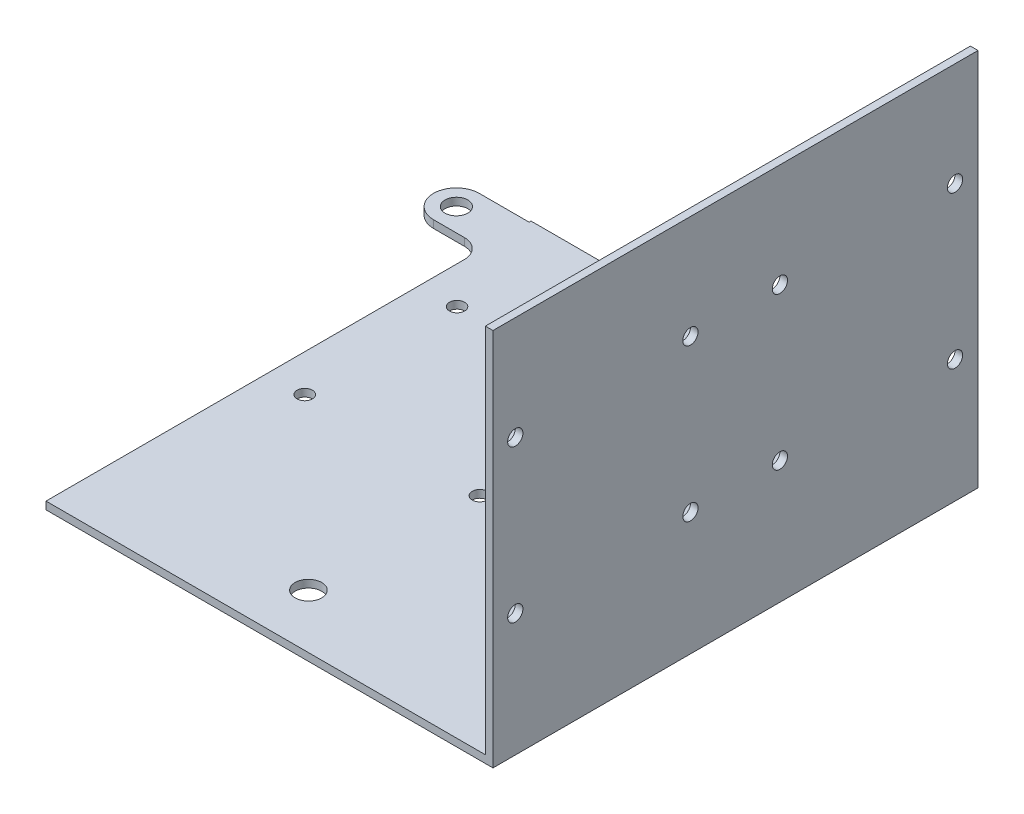
ISO-10303-21;
HEADER;
FILE_DESCRIPTION(('STEP AP214'),'2;1');
FILE_NAME('part.step','',(''),(''),'','','');
FILE_SCHEMA(('AUTOMOTIVE_DESIGN { 1 0 10303 214 1 1 1 1 }'));
ENDSEC;
DATA;
#1=APPLICATION_CONTEXT('core data for automotive mechanical design processes');
#2=APPLICATION_PROTOCOL_DEFINITION('international standard','automotive_design',2000,#1);
#3=PRODUCT_CONTEXT('',#1,'mechanical');
#4=PRODUCT('Part','Part','',(#3));
#5=PRODUCT_RELATED_PRODUCT_CATEGORY('part','',(#4));
#6=PRODUCT_DEFINITION_FORMATION('','',#4);
#7=PRODUCT_DEFINITION_CONTEXT('part definition',#1,'design');
#8=PRODUCT_DEFINITION('design','',#6,#7);
#9=PRODUCT_DEFINITION_SHAPE('','',#8);
#10=(LENGTH_UNIT() NAMED_UNIT(*) SI_UNIT(.MILLI.,.METRE.));
#11=(NAMED_UNIT(*) PLANE_ANGLE_UNIT() SI_UNIT($,.RADIAN.));
#12=(NAMED_UNIT(*) SI_UNIT($,.STERADIAN.) SOLID_ANGLE_UNIT());
#13=UNCERTAINTY_MEASURE_WITH_UNIT(LENGTH_MEASURE(1.E-05),#10,'distance_accuracy_value','');
#14=(GEOMETRIC_REPRESENTATION_CONTEXT(3) GLOBAL_UNCERTAINTY_ASSIGNED_CONTEXT((#13)) GLOBAL_UNIT_ASSIGNED_CONTEXT((#10,
#11,#12)) REPRESENTATION_CONTEXT('',''));
#15=CARTESIAN_POINT('',(0.,0.,0.));
#16=DIRECTION('',(0.,0.,1.));
#17=DIRECTION('',(1.,0.,0.));
#18=AXIS2_PLACEMENT_3D('',#15,#16,#17);
#19=CARTESIAN_POINT('',(-147.4,0.,0.));
#20=DIRECTION('',(1.,0.,0.));
#21=DIRECTION('',(0.,0.,1.));
#22=AXIS2_PLACEMENT_3D('',#19,#20,#21);
#23=PLANE('',#22);
#24=DIRECTION('',(0.,1.,0.));
#25=VECTOR('',#24,1.);
#26=CARTESIAN_POINT('',(-147.4,-29.6240277392602,-63.1959832251231));
#27=LINE('',#26,#25);
#28=CARTESIAN_POINT('',(-147.4,-29.6240277392602,-63.1959832251231));
#29=VERTEX_POINT('',#28);
#30=CARTESIAN_POINT('',(-147.4,-27.6240277392602,-63.1959832251231));
#31=VERTEX_POINT('',#30);
#32=EDGE_CURVE('E135',#29,#31,#27,.T.);
#33=ORIENTED_EDGE('',*,*,#32,.T.);
#34=DIRECTION('',(0.,0.,1.));
#35=VECTOR('',#34,1.);
#36=CARTESIAN_POINT('',(-147.4,-27.6240277392602,63.6959832251231));
#37=LINE('',#36,#35);
#38=CARTESIAN_POINT('',(-147.4,-27.6240277392602,-63.6959832251231));
#39=VERTEX_POINT('',#38);
#40=EDGE_CURVE('E221',#39,#31,#37,.T.);
#41=ORIENTED_EDGE('',*,*,#40,.F.);
#42=DIRECTION('',(0.,1.,0.));
#43=VECTOR('',#42,1.);
#44=CARTESIAN_POINT('',(-147.4,-29.6240277392602,-63.6959832251231));
#45=LINE('',#44,#43);
#46=CARTESIAN_POINT('',(-147.4,-29.6240277392602,-63.6959832251231));
#47=VERTEX_POINT('',#46);
#48=EDGE_CURVE('E216',#47,#39,#45,.T.);
#49=ORIENTED_EDGE('',*,*,#48,.F.);
#50=DIRECTION('',(0.,0.,-1.));
#51=VECTOR('',#50,1.);
#52=CARTESIAN_POINT('',(-147.4,-29.6240277392602,63.6959832251231));
#53=LINE('',#52,#51);
#54=EDGE_CURVE('E210',#29,#47,#53,.T.);
#55=ORIENTED_EDGE('',*,*,#54,.F.);
#56=EDGE_LOOP('',(#33,#41,#49,#55));
#57=FACE_BOUND('',#56,.T.);
#58=ADVANCED_FACE('F42',(#57),#23,.F.);
#59=CARTESIAN_POINT('',(-32.,0.,0.));
#60=DIRECTION('',(1.,0.,0.));
#61=DIRECTION('',(0.,0.,1.));
#62=AXIS2_PLACEMENT_3D('',#59,#60,#61);
#63=PLANE('',#62);
#64=CARTESIAN_POINT('',(-32.,42.6259722605978,11.8369154729343));
#65=DIRECTION('',(1.,0.,0.));
#66=DIRECTION('',(0.,0.,1.));
#67=AXIS2_PLACEMENT_3D('',#64,#65,#66);
#68=CIRCLE('',#67,2.);
#69=CARTESIAN_POINT('',(-32.,42.6259722605978,13.8369154729342));
#70=VERTEX_POINT('',#69);
#71=EDGE_CURVE('E236',#70,#70,#68,.T.);
#72=ORIENTED_EDGE('',*,*,#71,.T.);
#73=EDGE_LOOP('',(#72));
#74=FACE_BOUND('',#73,.T.);
#75=CARTESIAN_POINT('',(-32.,42.6259722605972,57.8369154729342));
#76=DIRECTION('',(1.,0.,0.));
#77=DIRECTION('',(0.,0.,1.));
#78=AXIS2_PLACEMENT_3D('',#75,#76,#77);
#79=CIRCLE('',#78,2.);
#80=CARTESIAN_POINT('',(-32.,42.6259722605972,59.8369154729342));
#81=VERTEX_POINT('',#80);
#82=EDGE_CURVE('E244',#81,#81,#79,.T.);
#83=ORIENTED_EDGE('',*,*,#82,.T.);
#84=EDGE_LOOP('',(#83));
#85=FACE_BOUND('',#84,.T.);
#86=CARTESIAN_POINT('',(-32.,2.62597226059716,57.8369154729337));
#87=DIRECTION('',(1.,0.,0.));
#88=DIRECTION('',(0.,0.,1.));
#89=AXIS2_PLACEMENT_3D('',#86,#87,#88);
#90=CIRCLE('',#89,2.);
#91=CARTESIAN_POINT('',(-32.,2.62597226059716,59.8369154729337));
#92=VERTEX_POINT('',#91);
#93=EDGE_CURVE('E252',#92,#92,#90,.T.);
#94=ORIENTED_EDGE('',*,*,#93,.T.);
#95=EDGE_LOOP('',(#94));
#96=FACE_BOUND('',#95,.T.);
#97=CARTESIAN_POINT('',(-32.,2.62597226059716,11.8369154729342));
#98=DIRECTION('',(1.,0.,0.));
#99=DIRECTION('',(0.,0.,1.));
#100=AXIS2_PLACEMENT_3D('',#97,#98,#99);
#101=CIRCLE('',#100,2.);
#102=CARTESIAN_POINT('',(-32.,2.62597226059716,13.8369154729342));
#103=VERTEX_POINT('',#102);
#104=EDGE_CURVE('E260',#103,#103,#101,.T.);
#105=ORIENTED_EDGE('',*,*,#104,.T.);
#106=EDGE_LOOP('',(#105));
#107=FACE_BOUND('',#106,.T.);
#108=CARTESIAN_POINT('',(-32.,2.62597226059716,-11.6630845271803));
#109=DIRECTION('',(1.,0.,0.));
#110=DIRECTION('',(0.,0.,-1.));
#111=AXIS2_PLACEMENT_3D('',#108,#109,#110);
#112=CIRCLE('',#111,2.);
#113=CARTESIAN_POINT('',(-32.,2.62597226059716,-13.6630845271803));
#114=VERTEX_POINT('',#113);
#115=EDGE_CURVE('E268',#114,#114,#112,.T.);
#116=ORIENTED_EDGE('',*,*,#115,.T.);
#117=EDGE_LOOP('',(#116));
#118=FACE_BOUND('',#117,.T.);
#119=CARTESIAN_POINT('',(-32.,2.62597226059716,-57.6630845271798));
#120=DIRECTION('',(1.,0.,0.));
#121=DIRECTION('',(0.,0.,-1.));
#122=AXIS2_PLACEMENT_3D('',#119,#120,#121);
#123=CIRCLE('',#122,2.);
#124=CARTESIAN_POINT('',(-32.,2.62597226059716,-59.6630845271798));
#125=VERTEX_POINT('',#124);
#126=EDGE_CURVE('E276',#125,#125,#123,.T.);
#127=ORIENTED_EDGE('',*,*,#126,.T.);
#128=EDGE_LOOP('',(#127));
#129=FACE_BOUND('',#128,.T.);
#130=CARTESIAN_POINT('',(-32.,42.6259722605972,-57.6630845271803));
#131=DIRECTION('',(1.,0.,0.));
#132=DIRECTION('',(0.,0.,-1.));
#133=AXIS2_PLACEMENT_3D('',#130,#131,#132);
#134=CIRCLE('',#133,2.);
#135=CARTESIAN_POINT('',(-32.,42.6259722605972,-59.6630845271803));
#136=VERTEX_POINT('',#135);
#137=EDGE_CURVE('E284',#136,#136,#134,.T.);
#138=ORIENTED_EDGE('',*,*,#137,.T.);
#139=EDGE_LOOP('',(#138));
#140=FACE_BOUND('',#139,.T.);
#141=CARTESIAN_POINT('',(-32.,42.6259722605978,-11.6630845271803));
#142=DIRECTION('',(1.,0.,0.));
#143=DIRECTION('',(0.,0.,-1.));
#144=AXIS2_PLACEMENT_3D('',#141,#142,#143);
#145=CIRCLE('',#144,2.);
#146=CARTESIAN_POINT('',(-32.,42.6259722605978,-13.6630845271803));
#147=VERTEX_POINT('',#146);
#148=EDGE_CURVE('E292',#147,#147,#145,.T.);
#149=ORIENTED_EDGE('',*,*,#148,.T.);
#150=EDGE_LOOP('',(#149));
#151=FACE_BOUND('',#150,.T.);
#152=DIRECTION('',(0.,0.,1.));
#153=VECTOR('',#152,1.);
#154=CARTESIAN_POINT('',(-32.,-27.6240277392602,63.6959832251231));
#155=LINE('',#154,#153);
#156=CARTESIAN_POINT('',(-32.,-27.6240277392602,-63.6959832251231));
#157=VERTEX_POINT('',#156);
#158=CARTESIAN_POINT('',(-32.,-27.6240277392602,63.6959832251231));
#159=VERTEX_POINT('',#158);
#160=EDGE_CURVE('E211',#157,#159,#155,.T.);
#161=ORIENTED_EDGE('',*,*,#160,.T.);
#162=DIRECTION('',(0.,-1.,0.));
#163=VECTOR('',#162,1.);
#164=CARTESIAN_POINT('',(-32.,69.8758174176556,63.6959832251231));
#165=LINE('',#164,#163);
#166=CARTESIAN_POINT('',(-32.,69.8758174176556,63.6959832251231));
#167=VERTEX_POINT('',#166);
#168=EDGE_CURVE('E309',#167,#159,#165,.T.);
#169=ORIENTED_EDGE('',*,*,#168,.F.);
#170=DIRECTION('',(0.,0.,1.));
#171=VECTOR('',#170,1.);
#172=CARTESIAN_POINT('',(-32.,69.8758174176556,-63.6959832251231));
#173=LINE('',#172,#171);
#174=CARTESIAN_POINT('',(-32.,69.8758174176556,-63.6959832251231));
#175=VERTEX_POINT('',#174);
#176=EDGE_CURVE('E304',#175,#167,#173,.T.);
#177=ORIENTED_EDGE('',*,*,#176,.F.);
#178=DIRECTION('',(0.,1.,0.));
#179=VECTOR('',#178,1.);
#180=CARTESIAN_POINT('',(-32.,69.8758174176556,-63.6959832251231));
#181=LINE('',#180,#179);
#182=EDGE_CURVE('E300',#157,#175,#181,.T.);
#183=ORIENTED_EDGE('',*,*,#182,.F.);
#184=EDGE_LOOP('',(#161,#169,#177,#183));
#185=FACE_BOUND('',#184,.T.);
#186=ADVANCED_FACE('F389',(#74,#85,#96,#107,#118,#129,#140,#151,#185),#63,.F.);
#187=CARTESIAN_POINT('',(-30.,0.,0.));
#188=DIRECTION('',(1.,0.,0.));
#189=DIRECTION('',(0.,0.,1.));
#190=AXIS2_PLACEMENT_3D('',#187,#188,#189);
#191=PLANE('',#190);
#192=CARTESIAN_POINT('',(-30.,42.6259722605972,57.8369154729342));
#193=DIRECTION('',(1.,0.,0.));
#194=DIRECTION('',(0.,0.,1.));
#195=AXIS2_PLACEMENT_3D('',#192,#193,#194);
#196=CIRCLE('',#195,2.);
#197=CARTESIAN_POINT('',(-30.,42.6259722605972,59.8369154729342));
#198=VERTEX_POINT('',#197);
#199=EDGE_CURVE('E240',#198,#198,#196,.T.);
#200=ORIENTED_EDGE('',*,*,#199,.F.);
#201=EDGE_LOOP('',(#200));
#202=FACE_BOUND('',#201,.T.);
#203=CARTESIAN_POINT('',(-30.,2.62597226059716,11.8369154729342));
#204=DIRECTION('',(1.,0.,0.));
#205=DIRECTION('',(0.,0.,1.));
#206=AXIS2_PLACEMENT_3D('',#203,#204,#205);
#207=CIRCLE('',#206,2.);
#208=CARTESIAN_POINT('',(-30.,2.62597226059716,13.8369154729342));
#209=VERTEX_POINT('',#208);
#210=EDGE_CURVE('E256',#209,#209,#207,.T.);
#211=ORIENTED_EDGE('',*,*,#210,.F.);
#212=EDGE_LOOP('',(#211));
#213=FACE_BOUND('',#212,.T.);
#214=CARTESIAN_POINT('',(-30.,2.62597226059716,-57.6630845271798));
#215=DIRECTION('',(1.,0.,0.));
#216=DIRECTION('',(0.,0.,-1.));
#217=AXIS2_PLACEMENT_3D('',#214,#215,#216);
#218=CIRCLE('',#217,2.);
#219=CARTESIAN_POINT('',(-30.,2.62597226059716,-59.6630845271798));
#220=VERTEX_POINT('',#219);
#221=EDGE_CURVE('E272',#220,#220,#218,.T.);
#222=ORIENTED_EDGE('',*,*,#221,.F.);
#223=EDGE_LOOP('',(#222));
#224=FACE_BOUND('',#223,.T.);
#225=CARTESIAN_POINT('',(-30.,42.6259722605978,-11.6630845271803));
#226=DIRECTION('',(1.,0.,0.));
#227=DIRECTION('',(0.,0.,-1.));
#228=AXIS2_PLACEMENT_3D('',#225,#226,#227);
#229=CIRCLE('',#228,2.);
#230=CARTESIAN_POINT('',(-30.,42.6259722605978,-13.6630845271803));
#231=VERTEX_POINT('',#230);
#232=EDGE_CURVE('E288',#231,#231,#229,.T.);
#233=ORIENTED_EDGE('',*,*,#232,.F.);
#234=EDGE_LOOP('',(#233));
#235=FACE_BOUND('',#234,.T.);
#236=DIRECTION('',(0.,1.,0.));
#237=VECTOR('',#236,1.);
#238=CARTESIAN_POINT('',(-30.,69.8758174176556,-63.6959832251231));
#239=LINE('',#238,#237);
#240=CARTESIAN_POINT('',(-30.,-29.6240277392602,-63.6959832251231));
#241=VERTEX_POINT('',#240);
#242=CARTESIAN_POINT('',(-30.,69.8758174176556,-63.6959832251231));
#243=VERTEX_POINT('',#242);
#244=EDGE_CURVE('E296',#241,#243,#239,.T.);
#245=ORIENTED_EDGE('',*,*,#244,.T.);
#246=DIRECTION('',(0.,0.,1.));
#247=VECTOR('',#246,1.);
#248=CARTESIAN_POINT('',(-30.,69.8758174176556,-63.6959832251231));
#249=LINE('',#248,#247);
#250=CARTESIAN_POINT('',(-30.,69.8758174176556,63.6959832251231));
#251=VERTEX_POINT('',#250);
#252=EDGE_CURVE('E317',#243,#251,#249,.T.);
#253=ORIENTED_EDGE('',*,*,#252,.T.);
#254=DIRECTION('',(0.,-1.,0.));
#255=VECTOR('',#254,1.);
#256=CARTESIAN_POINT('',(-30.,69.8758174176556,63.6959832251231));
#257=LINE('',#256,#255);
#258=CARTESIAN_POINT('',(-30.,-29.6240277392602,63.6959832251231));
#259=VERTEX_POINT('',#258);
#260=EDGE_CURVE('E321',#251,#259,#257,.T.);
#261=ORIENTED_EDGE('',*,*,#260,.T.);
#262=DIRECTION('',(0.,0.,-1.));
#263=VECTOR('',#262,1.);
#264=CARTESIAN_POINT('',(-30.,-29.6240277392602,-63.6959832251231));
#265=LINE('',#264,#263);
#266=EDGE_CURVE('E305',#259,#241,#265,.T.);
#267=ORIENTED_EDGE('',*,*,#266,.T.);
#268=EDGE_LOOP('',(#245,#253,#261,#267));
#269=FACE_BOUND('',#268,.T.);
#270=CARTESIAN_POINT('',(-30.,42.6259722605972,-57.6630845271803));
#271=DIRECTION('',(1.,0.,0.));
#272=DIRECTION('',(0.,0.,-1.));
#273=AXIS2_PLACEMENT_3D('',#270,#271,#272);
#274=CIRCLE('',#273,2.);
#275=CARTESIAN_POINT('',(-30.,42.6259722605972,-59.6630845271803));
#276=VERTEX_POINT('',#275);
#277=EDGE_CURVE('E280',#276,#276,#274,.T.);
#278=ORIENTED_EDGE('',*,*,#277,.F.);
#279=EDGE_LOOP('',(#278));
#280=FACE_BOUND('',#279,.T.);
#281=CARTESIAN_POINT('',(-30.,2.62597226059716,-11.6630845271803));
#282=DIRECTION('',(1.,0.,0.));
#283=DIRECTION('',(0.,0.,-1.));
#284=AXIS2_PLACEMENT_3D('',#281,#282,#283);
#285=CIRCLE('',#284,2.);
#286=CARTESIAN_POINT('',(-30.,2.62597226059716,-13.6630845271803));
#287=VERTEX_POINT('',#286);
#288=EDGE_CURVE('E264',#287,#287,#285,.T.);
#289=ORIENTED_EDGE('',*,*,#288,.F.);
#290=EDGE_LOOP('',(#289));
#291=FACE_BOUND('',#290,.T.);
#292=CARTESIAN_POINT('',(-30.,2.62597226059716,57.8369154729337));
#293=DIRECTION('',(1.,0.,0.));
#294=DIRECTION('',(0.,0.,1.));
#295=AXIS2_PLACEMENT_3D('',#292,#293,#294);
#296=CIRCLE('',#295,2.);
#297=CARTESIAN_POINT('',(-30.,2.62597226059716,59.8369154729337));
#298=VERTEX_POINT('',#297);
#299=EDGE_CURVE('E248',#298,#298,#296,.T.);
#300=ORIENTED_EDGE('',*,*,#299,.F.);
#301=EDGE_LOOP('',(#300));
#302=FACE_BOUND('',#301,.T.);
#303=CARTESIAN_POINT('',(-30.,42.6259722605978,11.8369154729343));
#304=DIRECTION('',(1.,0.,0.));
#305=DIRECTION('',(0.,0.,1.));
#306=AXIS2_PLACEMENT_3D('',#303,#304,#305);
#307=CIRCLE('',#306,2.);
#308=CARTESIAN_POINT('',(-30.,42.6259722605978,13.8369154729342));
#309=VERTEX_POINT('',#308);
#310=EDGE_CURVE('E235',#309,#309,#307,.T.);
#311=ORIENTED_EDGE('',*,*,#310,.F.);
#312=EDGE_LOOP('',(#311));
#313=FACE_BOUND('',#312,.T.);
#314=ADVANCED_FACE('F382',(#202,#213,#224,#235,#269,#280,#291,#302,#313),#191,.T.);
#315=CARTESIAN_POINT('',(-32.,69.8758174176556,-63.6959832251231));
#316=DIRECTION('',(0.,0.,1.));
#317=DIRECTION('',(-1.,0.,0.));
#318=AXIS2_PLACEMENT_3D('',#315,#316,#317);
#319=PLANE('',#318);
#320=ORIENTED_EDGE('',*,*,#244,.F.);
#321=DIRECTION('',(1.,0.,0.));
#322=VECTOR('',#321,1.);
#323=CARTESIAN_POINT('',(-32.,-29.6240277392602,-63.6959832251231));
#324=LINE('',#323,#322);
#325=EDGE_CURVE('E313',#47,#241,#324,.T.);
#326=ORIENTED_EDGE('',*,*,#325,.F.);
#327=ORIENTED_EDGE('',*,*,#48,.T.);
#328=DIRECTION('',(1.,0.,0.));
#329=VECTOR('',#328,1.);
#330=CARTESIAN_POINT('',(-147.4,-27.6240277392602,-63.6959832251231));
#331=LINE('',#330,#329);
#332=EDGE_CURVE('E232',#39,#157,#331,.T.);
#333=ORIENTED_EDGE('',*,*,#332,.T.);
#334=ORIENTED_EDGE('',*,*,#182,.T.);
#335=DIRECTION('',(1.,0.,0.));
#336=VECTOR('',#335,1.);
#337=CARTESIAN_POINT('',(-32.,69.8758174176556,-63.6959832251231));
#338=LINE('',#337,#336);
#339=EDGE_CURVE('E336',#175,#243,#338,.T.);
#340=ORIENTED_EDGE('',*,*,#339,.T.);
#341=EDGE_LOOP('',(#320,#326,#327,#333,#334,#340));
#342=FACE_BOUND('',#341,.T.);
#343=ADVANCED_FACE('F378',(#342),#319,.F.);
#344=CARTESIAN_POINT('',(-32.,69.8758174176556,-63.6959832251231));
#345=DIRECTION('',(0.,-1.,0.));
#346=DIRECTION('',(0.,0.,-1.));
#347=AXIS2_PLACEMENT_3D('',#344,#345,#346);
#348=PLANE('',#347);
#349=ORIENTED_EDGE('',*,*,#252,.F.);
#350=ORIENTED_EDGE('',*,*,#339,.F.);
#351=ORIENTED_EDGE('',*,*,#176,.T.);
#352=DIRECTION('',(1.,0.,0.));
#353=VECTOR('',#352,1.);
#354=CARTESIAN_POINT('',(-32.,69.8758174176556,63.6959832251231));
#355=LINE('',#354,#353);
#356=EDGE_CURVE('E333',#167,#251,#355,.T.);
#357=ORIENTED_EDGE('',*,*,#356,.T.);
#358=EDGE_LOOP('',(#349,#350,#351,#357));
#359=FACE_BOUND('',#358,.T.);
#360=ADVANCED_FACE('F392',(#359),#348,.F.);
#361=CARTESIAN_POINT('',(-32.,69.8758174176556,63.6959832251231));
#362=DIRECTION('',(0.,0.,-1.));
#363=DIRECTION('',(1.,0.,0.));
#364=AXIS2_PLACEMENT_3D('',#361,#362,#363);
#365=PLANE('',#364);
#366=ORIENTED_EDGE('',*,*,#260,.F.);
#367=ORIENTED_EDGE('',*,*,#356,.F.);
#368=ORIENTED_EDGE('',*,*,#168,.T.);
#369=DIRECTION('',(1.,0.,0.));
#370=VECTOR('',#369,1.);
#371=CARTESIAN_POINT('',(-147.4,-27.6240277392602,63.6959832251231));
#372=LINE('',#371,#370);
#373=CARTESIAN_POINT('',(-147.4,-27.6240277392602,63.6959832251231));
#374=VERTEX_POINT('',#373);
#375=EDGE_CURVE('E225',#374,#159,#372,.T.);
#376=ORIENTED_EDGE('',*,*,#375,.F.);
#377=DIRECTION('',(0.,-1.,0.));
#378=VECTOR('',#377,1.);
#379=CARTESIAN_POINT('',(-147.4,-29.6240277392602,63.6959832251231));
#380=LINE('',#379,#378);
#381=CARTESIAN_POINT('',(-147.4,-29.6240277392602,63.6959832251231));
#382=VERTEX_POINT('',#381);
#383=EDGE_CURVE('E206',#374,#382,#380,.T.);
#384=ORIENTED_EDGE('',*,*,#383,.T.);
#385=DIRECTION('',(1.,0.,0.));
#386=VECTOR('',#385,1.);
#387=CARTESIAN_POINT('',(-32.,-29.6240277392602,63.6959832251231));
#388=LINE('',#387,#386);
#389=EDGE_CURVE('E330',#382,#259,#388,.T.);
#390=ORIENTED_EDGE('',*,*,#389,.T.);
#391=EDGE_LOOP('',(#366,#367,#368,#376,#384,#390));
#392=FACE_BOUND('',#391,.T.);
#393=ADVANCED_FACE('F386',(#392),#365,.F.);
#394=CARTESIAN_POINT('',(-32.,-29.6240277392602,-63.6959832251231));
#395=DIRECTION('',(0.,1.,0.));
#396=DIRECTION('',(0.,0.,1.));
#397=AXIS2_PLACEMENT_3D('',#394,#395,#396);
#398=PLANE('',#397);
#399=CARTESIAN_POINT('',(-92.6699679748699,-29.6240277392602,49.5040167748774));
#400=DIRECTION('',(0.,-1.,0.));
#401=DIRECTION('',(0.,0.,1.));
#402=AXIS2_PLACEMENT_3D('',#399,#400,#401);
#403=CIRCLE('',#402,3.50000000000001);
#404=CARTESIAN_POINT('',(-92.6699679748699,-29.6240277392602,53.0040167748775));
#405=VERTEX_POINT('',#404);
#406=EDGE_CURVE('E174',#405,#405,#403,.T.);
#407=ORIENTED_EDGE('',*,*,#406,.F.);
#408=EDGE_LOOP('',(#407));
#409=FACE_BOUND('',#408,.T.);
#410=CARTESIAN_POINT('',(-70.9905287898396,-29.6240277392602,0.0861680122466457));
#411=DIRECTION('',(0.,-1.,0.));
#412=DIRECTION('',(0.,0.,1.));
#413=AXIS2_PLACEMENT_3D('',#410,#411,#412);
#414=CIRCLE('',#413,3.5);
#415=CARTESIAN_POINT('',(-70.9905287898396,-29.6240277392602,3.58616801224665));
#416=VERTEX_POINT('',#415);
#417=EDGE_CURVE('E171',#416,#416,#414,.T.);
#418=ORIENTED_EDGE('',*,*,#417,.F.);
#419=EDGE_LOOP('',(#418));
#420=FACE_BOUND('',#419,.T.);
#421=CARTESIAN_POINT('',(-137.65,-29.6240277392602,-34.5125559976324));
#422=DIRECTION('',(0.,-1.,0.));
#423=DIRECTION('',(0.,0.,1.));
#424=AXIS2_PLACEMENT_3D('',#421,#422,#423);
#425=CIRCLE('',#424,2.);
#426=CARTESIAN_POINT('',(-137.65,-29.6240277392602,-32.5125559976324));
#427=VERTEX_POINT('',#426);
#428=EDGE_CURVE('E178',#427,#427,#425,.T.);
#429=ORIENTED_EDGE('',*,*,#428,.F.);
#430=EDGE_LOOP('',(#429));
#431=FACE_BOUND('',#430,.T.);
#432=CARTESIAN_POINT('',(-137.65,-29.6240277392602,5.48744400236763));
#433=DIRECTION('',(0.,-1.,0.));
#434=DIRECTION('',(0.,0.,1.));
#435=AXIS2_PLACEMENT_3D('',#432,#433,#434);
#436=CIRCLE('',#435,2.);
#437=CARTESIAN_POINT('',(-137.65,-29.6240277392602,7.48744400236763));
#438=VERTEX_POINT('',#437);
#439=EDGE_CURVE('E195',#438,#438,#436,.T.);
#440=ORIENTED_EDGE('',*,*,#439,.F.);
#441=EDGE_LOOP('',(#440));
#442=FACE_BOUND('',#441,.T.);
#443=CARTESIAN_POINT('',(-91.65,-29.6240277392602,5.48744400236762));
#444=DIRECTION('',(0.,-1.,0.));
#445=DIRECTION('',(0.,0.,1.));
#446=AXIS2_PLACEMENT_3D('',#443,#444,#445);
#447=CIRCLE('',#446,2.);
#448=CARTESIAN_POINT('',(-91.65,-29.6240277392602,7.48744400236762));
#449=VERTEX_POINT('',#448);
#450=EDGE_CURVE('E190',#449,#449,#447,.T.);
#451=ORIENTED_EDGE('',*,*,#450,.F.);
#452=EDGE_LOOP('',(#451));
#453=FACE_BOUND('',#452,.T.);
#454=CARTESIAN_POINT('',(-91.65,-29.6240277392602,-34.5125559976324));
#455=DIRECTION('',(0.,-1.,0.));
#456=DIRECTION('',(0.,0.,1.));
#457=AXIS2_PLACEMENT_3D('',#454,#455,#456);
#458=CIRCLE('',#457,1.99999999999999);
#459=CARTESIAN_POINT('',(-91.65,-29.6240277392602,-32.5125559976324));
#460=VERTEX_POINT('',#459);
#461=EDGE_CURVE('E194',#460,#460,#458,.T.);
#462=ORIENTED_EDGE('',*,*,#461,.F.);
#463=EDGE_LOOP('',(#462));
#464=FACE_BOUND('',#463,.T.);
#465=ORIENTED_EDGE('',*,*,#266,.F.);
#466=ORIENTED_EDGE('',*,*,#389,.F.);
#467=CARTESIAN_POINT('',(-147.4,-29.6240277392602,-46.1959832251231));
#468=VERTEX_POINT('',#467);
#469=EDGE_CURVE('E212',#382,#468,#53,.T.);
#470=ORIENTED_EDGE('',*,*,#469,.T.);
#471=CARTESIAN_POINT('',(-152.4,-29.6240277392602,-46.1959832251231));
#472=DIRECTION('',(0.,-1.,0.));
#473=DIRECTION('',(0.,0.,1.));
#474=AXIS2_PLACEMENT_3D('',#471,#472,#473);
#475=CIRCLE('',#474,5.);
#476=CARTESIAN_POINT('',(-152.4,-29.6240277392602,-51.1959832251231));
#477=VERTEX_POINT('',#476);
#478=EDGE_CURVE('E11',#477,#468,#475,.T.);
#479=ORIENTED_EDGE('',*,*,#478,.F.);
#480=DIRECTION('',(-1.,0.,0.));
#481=VECTOR('',#480,1.);
#482=CARTESIAN_POINT('',(-160.5,-29.6240277392602,-51.1959832251231));
#483=LINE('',#482,#481);
#484=CARTESIAN_POINT('',(-160.5,-29.6240277392602,-51.1959832251231));
#485=VERTEX_POINT('',#484);
#486=EDGE_CURVE('E136',#477,#485,#483,.T.);
#487=ORIENTED_EDGE('',*,*,#486,.T.);
#488=CARTESIAN_POINT('',(-160.5,-29.6240277392602,-57.1959832251231));
#489=DIRECTION('',(0.,-1.,0.));
#490=DIRECTION('',(0.,0.,1.));
#491=AXIS2_PLACEMENT_3D('',#488,#489,#490);
#492=CIRCLE('',#491,6.);
#493=CARTESIAN_POINT('',(-160.5,-29.6240277392602,-63.1959832251231));
#494=VERTEX_POINT('',#493);
#495=EDGE_CURVE('E128',#485,#494,#492,.T.);
#496=ORIENTED_EDGE('',*,*,#495,.T.);
#497=DIRECTION('',(1.,0.,0.));
#498=VECTOR('',#497,1.);
#499=CARTESIAN_POINT('',(-160.5,-29.6240277392602,-63.1959832251231));
#500=LINE('',#499,#498);
#501=EDGE_CURVE('E139',#494,#29,#500,.T.);
#502=ORIENTED_EDGE('',*,*,#501,.T.);
#503=ORIENTED_EDGE('',*,*,#54,.T.);
#504=ORIENTED_EDGE('',*,*,#325,.T.);
#505=EDGE_LOOP('',(#465,#466,#470,#479,#487,#496,#502,#503,#504));
#506=FACE_BOUND('',#505,.T.);
#507=CARTESIAN_POINT('',(-160.5,-29.6240277392602,-57.1959832251231));
#508=DIRECTION('',(0.,-1.,0.));
#509=DIRECTION('',(0.,0.,1.));
#510=AXIS2_PLACEMENT_3D('',#507,#508,#509);
#511=CIRCLE('',#510,2.99999999999999);
#512=CARTESIAN_POINT('',(-160.5,-29.6240277392602,-54.1959832251231));
#513=VERTEX_POINT('',#512);
#514=EDGE_CURVE('E165',#513,#513,#511,.T.);
#515=ORIENTED_EDGE('',*,*,#514,.F.);
#516=EDGE_LOOP('',(#515));
#517=FACE_BOUND('',#516,.T.);
#518=ADVANCED_FACE('F148',(#409,#420,#431,#442,#453,#464,#506,#517),#398,.F.);
#519=CARTESIAN_POINT('',(-32.,42.6259722605978,-11.6630845271803));
#520=DIRECTION('',(1.,0.,0.));
#521=DIRECTION('',(0.,0.,1.));
#522=AXIS2_PLACEMENT_3D('',#519,#520,#521);
#523=CYLINDRICAL_SURFACE('',#522,2.);
#524=ORIENTED_EDGE('',*,*,#148,.F.);
#525=EDGE_LOOP('',(#524));
#526=FACE_BOUND('',#525,.T.);
#527=ORIENTED_EDGE('',*,*,#232,.T.);
#528=EDGE_LOOP('',(#527));
#529=FACE_BOUND('',#528,.T.);
#530=ADVANCED_FACE('F449',(#526,#529),#523,.F.);
#531=CARTESIAN_POINT('',(-32.,42.6259722605972,-57.6630845271803));
#532=DIRECTION('',(1.,0.,0.));
#533=DIRECTION('',(0.,0.,1.));
#534=AXIS2_PLACEMENT_3D('',#531,#532,#533);
#535=CYLINDRICAL_SURFACE('',#534,2.);
#536=ORIENTED_EDGE('',*,*,#137,.F.);
#537=EDGE_LOOP('',(#536));
#538=FACE_BOUND('',#537,.T.);
#539=ORIENTED_EDGE('',*,*,#277,.T.);
#540=EDGE_LOOP('',(#539));
#541=FACE_BOUND('',#540,.T.);
#542=ADVANCED_FACE('F445',(#538,#541),#535,.F.);
#543=CARTESIAN_POINT('',(-32.,2.62597226059716,-57.6630845271798));
#544=DIRECTION('',(1.,0.,0.));
#545=DIRECTION('',(0.,0.,1.));
#546=AXIS2_PLACEMENT_3D('',#543,#544,#545);
#547=CYLINDRICAL_SURFACE('',#546,2.);
#548=ORIENTED_EDGE('',*,*,#126,.F.);
#549=EDGE_LOOP('',(#548));
#550=FACE_BOUND('',#549,.T.);
#551=ORIENTED_EDGE('',*,*,#221,.T.);
#552=EDGE_LOOP('',(#551));
#553=FACE_BOUND('',#552,.T.);
#554=ADVANCED_FACE('F441',(#550,#553),#547,.F.);
#555=CARTESIAN_POINT('',(-32.,2.62597226059716,-11.6630845271803));
#556=DIRECTION('',(1.,0.,0.));
#557=DIRECTION('',(0.,0.,1.));
#558=AXIS2_PLACEMENT_3D('',#555,#556,#557);
#559=CYLINDRICAL_SURFACE('',#558,2.);
#560=ORIENTED_EDGE('',*,*,#115,.F.);
#561=EDGE_LOOP('',(#560));
#562=FACE_BOUND('',#561,.T.);
#563=ORIENTED_EDGE('',*,*,#288,.T.);
#564=EDGE_LOOP('',(#563));
#565=FACE_BOUND('',#564,.T.);
#566=ADVANCED_FACE('F437',(#562,#565),#559,.F.);
#567=CARTESIAN_POINT('',(-32.,2.62597226059716,11.8369154729342));
#568=DIRECTION('',(1.,0.,0.));
#569=DIRECTION('',(0.,0.,1.));
#570=AXIS2_PLACEMENT_3D('',#567,#568,#569);
#571=CYLINDRICAL_SURFACE('',#570,2.);
#572=ORIENTED_EDGE('',*,*,#104,.F.);
#573=EDGE_LOOP('',(#572));
#574=FACE_BOUND('',#573,.T.);
#575=ORIENTED_EDGE('',*,*,#210,.T.);
#576=EDGE_LOOP('',(#575));
#577=FACE_BOUND('',#576,.T.);
#578=ADVANCED_FACE('F433',(#574,#577),#571,.F.);
#579=CARTESIAN_POINT('',(-32.,2.62597226059716,57.8369154729337));
#580=DIRECTION('',(1.,0.,0.));
#581=DIRECTION('',(0.,0.,1.));
#582=AXIS2_PLACEMENT_3D('',#579,#580,#581);
#583=CYLINDRICAL_SURFACE('',#582,2.);
#584=ORIENTED_EDGE('',*,*,#93,.F.);
#585=EDGE_LOOP('',(#584));
#586=FACE_BOUND('',#585,.T.);
#587=ORIENTED_EDGE('',*,*,#299,.T.);
#588=EDGE_LOOP('',(#587));
#589=FACE_BOUND('',#588,.T.);
#590=ADVANCED_FACE('F429',(#586,#589),#583,.F.);
#591=CARTESIAN_POINT('',(-32.,42.6259722605972,57.8369154729342));
#592=DIRECTION('',(1.,0.,0.));
#593=DIRECTION('',(0.,0.,1.));
#594=AXIS2_PLACEMENT_3D('',#591,#592,#593);
#595=CYLINDRICAL_SURFACE('',#594,2.);
#596=ORIENTED_EDGE('',*,*,#82,.F.);
#597=EDGE_LOOP('',(#596));
#598=FACE_BOUND('',#597,.T.);
#599=ORIENTED_EDGE('',*,*,#199,.T.);
#600=EDGE_LOOP('',(#599));
#601=FACE_BOUND('',#600,.T.);
#602=ADVANCED_FACE('F422',(#598,#601),#595,.F.);
#603=CARTESIAN_POINT('',(-32.,42.6259722605978,11.8369154729343));
#604=DIRECTION('',(1.,0.,0.));
#605=DIRECTION('',(0.,0.,1.));
#606=AXIS2_PLACEMENT_3D('',#603,#604,#605);
#607=CYLINDRICAL_SURFACE('',#606,2.);
#608=ORIENTED_EDGE('',*,*,#71,.F.);
#609=EDGE_LOOP('',(#608));
#610=FACE_BOUND('',#609,.T.);
#611=ORIENTED_EDGE('',*,*,#310,.T.);
#612=EDGE_LOOP('',(#611));
#613=FACE_BOUND('',#612,.T.);
#614=ADVANCED_FACE('F417',(#610,#613),#607,.F.);
#615=CARTESIAN_POINT('',(-147.4,-27.6240277392602,63.6959832251231));
#616=DIRECTION('',(0.,-1.,0.));
#617=DIRECTION('',(0.,0.,-1.));
#618=AXIS2_PLACEMENT_3D('',#615,#616,#617);
#619=PLANE('',#618);
#620=CARTESIAN_POINT('',(-92.6699679748699,-27.6240277392602,49.5040167748774));
#621=DIRECTION('',(0.,-1.,0.));
#622=DIRECTION('',(0.,0.,1.));
#623=AXIS2_PLACEMENT_3D('',#620,#621,#622);
#624=CIRCLE('',#623,3.50000000000001);
#625=CARTESIAN_POINT('',(-92.6699679748699,-27.6240277392602,53.0040167748775));
#626=VERTEX_POINT('',#625);
#627=EDGE_CURVE('E179',#626,#626,#624,.T.);
#628=ORIENTED_EDGE('',*,*,#627,.T.);
#629=EDGE_LOOP('',(#628));
#630=FACE_BOUND('',#629,.T.);
#631=CARTESIAN_POINT('',(-70.9905287898396,-27.6240277392602,0.0861680122466457));
#632=DIRECTION('',(0.,-1.,0.));
#633=DIRECTION('',(0.,0.,1.));
#634=AXIS2_PLACEMENT_3D('',#631,#632,#633);
#635=CIRCLE('',#634,3.5);
#636=CARTESIAN_POINT('',(-70.9905287898396,-27.6240277392602,3.58616801224665));
#637=VERTEX_POINT('',#636);
#638=EDGE_CURVE('E183',#637,#637,#635,.T.);
#639=ORIENTED_EDGE('',*,*,#638,.T.);
#640=EDGE_LOOP('',(#639));
#641=FACE_BOUND('',#640,.T.);
#642=CARTESIAN_POINT('',(-137.65,-27.6240277392602,-34.5125559976324));
#643=DIRECTION('',(0.,1.,0.));
#644=DIRECTION('',(0.,0.,-1.));
#645=AXIS2_PLACEMENT_3D('',#642,#643,#644);
#646=CIRCLE('',#645,2.);
#647=CARTESIAN_POINT('',(-137.65,-27.6240277392602,-36.5125559976324));
#648=VERTEX_POINT('',#647);
#649=EDGE_CURVE('E229',#648,#648,#646,.T.);
#650=ORIENTED_EDGE('',*,*,#649,.F.);
#651=EDGE_LOOP('',(#650));
#652=FACE_BOUND('',#651,.T.);
#653=CARTESIAN_POINT('',(-137.65,-27.6240277392602,5.48744400236763));
#654=DIRECTION('',(0.,1.,0.));
#655=DIRECTION('',(0.,0.,-1.));
#656=AXIS2_PLACEMENT_3D('',#653,#654,#655);
#657=CIRCLE('',#656,2.);
#658=CARTESIAN_POINT('',(-137.65,-27.6240277392602,3.48744400236763));
#659=VERTEX_POINT('',#658);
#660=EDGE_CURVE('E347',#659,#659,#657,.T.);
#661=ORIENTED_EDGE('',*,*,#660,.F.);
#662=EDGE_LOOP('',(#661));
#663=FACE_BOUND('',#662,.T.);
#664=CARTESIAN_POINT('',(-91.65,-27.6240277392602,5.48744400236762));
#665=DIRECTION('',(0.,1.,0.));
#666=DIRECTION('',(0.,0.,-1.));
#667=AXIS2_PLACEMENT_3D('',#664,#665,#666);
#668=CIRCLE('',#667,2.);
#669=CARTESIAN_POINT('',(-91.65,-27.6240277392602,3.48744400236763));
#670=VERTEX_POINT('',#669);
#671=EDGE_CURVE('E343',#670,#670,#668,.T.);
#672=ORIENTED_EDGE('',*,*,#671,.F.);
#673=EDGE_LOOP('',(#672));
#674=FACE_BOUND('',#673,.T.);
#675=CARTESIAN_POINT('',(-91.65,-27.6240277392602,-34.5125559976324));
#676=DIRECTION('',(0.,1.,0.));
#677=DIRECTION('',(0.,0.,-1.));
#678=AXIS2_PLACEMENT_3D('',#675,#676,#677);
#679=CIRCLE('',#678,1.99999999999999);
#680=CARTESIAN_POINT('',(-91.65,-27.6240277392602,-36.5125559976324));
#681=VERTEX_POINT('',#680);
#682=EDGE_CURVE('E205',#681,#681,#679,.T.);
#683=ORIENTED_EDGE('',*,*,#682,.F.);
#684=EDGE_LOOP('',(#683));
#685=FACE_BOUND('',#684,.T.);
#686=ORIENTED_EDGE('',*,*,#160,.F.);
#687=ORIENTED_EDGE('',*,*,#332,.F.);
#688=ORIENTED_EDGE('',*,*,#40,.T.);
#689=DIRECTION('',(1.,0.,0.));
#690=VECTOR('',#689,1.);
#691=CARTESIAN_POINT('',(-160.5,-27.6240277392602,-63.1959832251231));
#692=LINE('',#691,#690);
#693=CARTESIAN_POINT('',(-160.5,-27.6240277392602,-63.1959832251231));
#694=VERTEX_POINT('',#693);
#695=EDGE_CURVE('E155',#694,#31,#692,.T.);
#696=ORIENTED_EDGE('',*,*,#695,.F.);
#697=CARTESIAN_POINT('',(-160.5,-27.6240277392602,-57.1959832251231));
#698=DIRECTION('',(0.,-1.,0.));
#699=DIRECTION('',(0.,0.,1.));
#700=AXIS2_PLACEMENT_3D('',#697,#698,#699);
#701=CIRCLE('',#700,6.);
#702=CARTESIAN_POINT('',(-160.5,-27.6240277392602,-51.1959832251231));
#703=VERTEX_POINT('',#702);
#704=EDGE_CURVE('E131',#703,#694,#701,.T.);
#705=ORIENTED_EDGE('',*,*,#704,.F.);
#706=DIRECTION('',(-1.,0.,0.));
#707=VECTOR('',#706,1.);
#708=CARTESIAN_POINT('',(-160.5,-27.6240277392602,-51.1959832251231));
#709=LINE('',#708,#707);
#710=CARTESIAN_POINT('',(-152.4,-27.6240277392602,-51.1959832251231));
#711=VERTEX_POINT('',#710);
#712=EDGE_CURVE('E152',#711,#703,#709,.T.);
#713=ORIENTED_EDGE('',*,*,#712,.F.);
#714=CARTESIAN_POINT('',(-152.4,-27.6240277392602,-46.1959832251231));
#715=DIRECTION('',(0.,1.,0.));
#716=DIRECTION('',(0.,0.,-1.));
#717=AXIS2_PLACEMENT_3D('',#714,#715,#716);
#718=CIRCLE('',#717,5.);
#719=CARTESIAN_POINT('',(-147.4,-27.6240277392602,-46.1959832251231));
#720=VERTEX_POINT('',#719);
#721=EDGE_CURVE('E51',#720,#711,#718,.T.);
#722=ORIENTED_EDGE('',*,*,#721,.F.);
#723=EDGE_CURVE('E220',#720,#374,#37,.T.);
#724=ORIENTED_EDGE('',*,*,#723,.T.);
#725=ORIENTED_EDGE('',*,*,#375,.T.);
#726=EDGE_LOOP('',(#686,#687,#688,#696,#705,#713,#722,#724,#725));
#727=FACE_BOUND('',#726,.T.);
#728=CARTESIAN_POINT('',(-160.5,-27.6240277392602,-57.1959832251231));
#729=DIRECTION('',(0.,-1.,0.));
#730=DIRECTION('',(0.,0.,1.));
#731=AXIS2_PLACEMENT_3D('',#728,#729,#730);
#732=CIRCLE('',#731,2.99999999999999);
#733=CARTESIAN_POINT('',(-160.5,-27.6240277392602,-54.1959832251231));
#734=VERTEX_POINT('',#733);
#735=EDGE_CURVE('E158',#734,#734,#732,.T.);
#736=ORIENTED_EDGE('',*,*,#735,.T.);
#737=EDGE_LOOP('',(#736));
#738=FACE_BOUND('',#737,.T.);
#739=ADVANCED_FACE('F363',(#630,#641,#652,#663,#674,#685,#727,#738),#619,.F.);
#740=ORIENTED_EDGE('',*,*,#469,.F.);
#741=ORIENTED_EDGE('',*,*,#383,.F.);
#742=ORIENTED_EDGE('',*,*,#723,.F.);
#743=DIRECTION('',(0.,1.,0.));
#744=VECTOR('',#743,1.);
#745=CARTESIAN_POINT('',(-147.4,0.,-46.1959832251231));
#746=LINE('',#745,#744);
#747=EDGE_CURVE('E339',#468,#720,#746,.T.);
#748=ORIENTED_EDGE('',*,*,#747,.F.);
#749=EDGE_LOOP('',(#740,#741,#742,#748));
#750=FACE_BOUND('',#749,.T.);
#751=ADVANCED_FACE('F369',(#750),#23,.F.);
#752=CARTESIAN_POINT('',(-91.65,-29.6240277392602,-34.5125559976324));
#753=DIRECTION('',(0.,1.,0.));
#754=DIRECTION('',(0.,0.,1.));
#755=AXIS2_PLACEMENT_3D('',#752,#753,#754);
#756=CYLINDRICAL_SURFACE('',#755,1.99999999999999);
#757=ORIENTED_EDGE('',*,*,#461,.T.);
#758=EDGE_LOOP('',(#757));
#759=FACE_BOUND('',#758,.T.);
#760=ORIENTED_EDGE('',*,*,#682,.T.);
#761=EDGE_LOOP('',(#760));
#762=FACE_BOUND('',#761,.T.);
#763=ADVANCED_FACE('F410',(#759,#762),#756,.F.);
#764=CARTESIAN_POINT('',(-91.65,-29.6240277392602,5.48744400236762));
#765=DIRECTION('',(0.,1.,0.));
#766=DIRECTION('',(0.,0.,1.));
#767=AXIS2_PLACEMENT_3D('',#764,#765,#766);
#768=CYLINDRICAL_SURFACE('',#767,2.);
#769=ORIENTED_EDGE('',*,*,#450,.T.);
#770=EDGE_LOOP('',(#769));
#771=FACE_BOUND('',#770,.T.);
#772=ORIENTED_EDGE('',*,*,#671,.T.);
#773=EDGE_LOOP('',(#772));
#774=FACE_BOUND('',#773,.T.);
#775=ADVANCED_FACE('F415',(#771,#774),#768,.F.);
#776=CARTESIAN_POINT('',(-137.65,-29.6240277392602,5.48744400236763));
#777=DIRECTION('',(0.,1.,0.));
#778=DIRECTION('',(0.,0.,1.));
#779=AXIS2_PLACEMENT_3D('',#776,#777,#778);
#780=CYLINDRICAL_SURFACE('',#779,2.);
#781=ORIENTED_EDGE('',*,*,#439,.T.);
#782=EDGE_LOOP('',(#781));
#783=FACE_BOUND('',#782,.T.);
#784=ORIENTED_EDGE('',*,*,#660,.T.);
#785=EDGE_LOOP('',(#784));
#786=FACE_BOUND('',#785,.T.);
#787=ADVANCED_FACE('F478',(#783,#786),#780,.F.);
#788=CARTESIAN_POINT('',(-137.65,-29.6240277392602,-34.5125559976324));
#789=DIRECTION('',(0.,1.,0.));
#790=DIRECTION('',(0.,0.,1.));
#791=AXIS2_PLACEMENT_3D('',#788,#789,#790);
#792=CYLINDRICAL_SURFACE('',#791,2.);
#793=ORIENTED_EDGE('',*,*,#428,.T.);
#794=EDGE_LOOP('',(#793));
#795=FACE_BOUND('',#794,.T.);
#796=ORIENTED_EDGE('',*,*,#649,.T.);
#797=EDGE_LOOP('',(#796));
#798=FACE_BOUND('',#797,.T.);
#799=ADVANCED_FACE('F485',(#795,#798),#792,.F.);
#800=CARTESIAN_POINT('',(-70.9905287898396,-29.6240277392602,0.0861680122466457));
#801=DIRECTION('',(0.,1.,0.));
#802=DIRECTION('',(0.,0.,1.));
#803=AXIS2_PLACEMENT_3D('',#800,#801,#802);
#804=CYLINDRICAL_SURFACE('',#803,3.5);
#805=ORIENTED_EDGE('',*,*,#417,.T.);
#806=EDGE_LOOP('',(#805));
#807=FACE_BOUND('',#806,.T.);
#808=ORIENTED_EDGE('',*,*,#638,.F.);
#809=EDGE_LOOP('',(#808));
#810=FACE_BOUND('',#809,.T.);
#811=ADVANCED_FACE('F489',(#807,#810),#804,.F.);
#812=CARTESIAN_POINT('',(-92.6699679748699,-29.6240277392602,49.5040167748774));
#813=DIRECTION('',(0.,1.,0.));
#814=DIRECTION('',(0.,0.,1.));
#815=AXIS2_PLACEMENT_3D('',#812,#813,#814);
#816=CYLINDRICAL_SURFACE('',#815,3.50000000000001);
#817=ORIENTED_EDGE('',*,*,#406,.T.);
#818=EDGE_LOOP('',(#817));
#819=FACE_BOUND('',#818,.T.);
#820=ORIENTED_EDGE('',*,*,#627,.F.);
#821=EDGE_LOOP('',(#820));
#822=FACE_BOUND('',#821,.T.);
#823=ADVANCED_FACE('F497',(#819,#822),#816,.F.);
#824=CARTESIAN_POINT('',(-160.5,-29.6240277392602,-57.1959832251231));
#825=DIRECTION('',(0.,1.,0.));
#826=DIRECTION('',(0.,0.,1.));
#827=AXIS2_PLACEMENT_3D('',#824,#825,#826);
#828=CYLINDRICAL_SURFACE('',#827,6.);
#829=ORIENTED_EDGE('',*,*,#704,.T.);
#830=DIRECTION('',(0.,1.,0.));
#831=VECTOR('',#830,1.);
#832=CARTESIAN_POINT('',(-160.5,-29.6240277392602,-63.1959832251231));
#833=LINE('',#832,#831);
#834=EDGE_CURVE('E124',#494,#694,#833,.T.);
#835=ORIENTED_EDGE('',*,*,#834,.F.);
#836=ORIENTED_EDGE('',*,*,#495,.F.);
#837=DIRECTION('',(0.,1.,0.));
#838=VECTOR('',#837,1.);
#839=CARTESIAN_POINT('',(-160.5,-29.6240277392602,-51.1959832251231));
#840=LINE('',#839,#838);
#841=EDGE_CURVE('E168',#485,#703,#840,.T.);
#842=ORIENTED_EDGE('',*,*,#841,.T.);
#843=EDGE_LOOP('',(#829,#835,#836,#842));
#844=FACE_BOUND('',#843,.T.);
#845=ADVANCED_FACE('F126',(#844),#828,.T.);
#846=CARTESIAN_POINT('',(-160.5,-29.6240277392602,-51.1959832251231));
#847=DIRECTION('',(0.,0.,1.));
#848=DIRECTION('',(-1.,0.,0.));
#849=AXIS2_PLACEMENT_3D('',#846,#847,#848);
#850=PLANE('',#849);
#851=ORIENTED_EDGE('',*,*,#712,.T.);
#852=ORIENTED_EDGE('',*,*,#841,.F.);
#853=ORIENTED_EDGE('',*,*,#486,.F.);
#854=DIRECTION('',(0.,1.,0.));
#855=VECTOR('',#854,1.);
#856=CARTESIAN_POINT('',(-152.4,-29.6240277392602,-51.1959832251231));
#857=LINE('',#856,#855);
#858=EDGE_CURVE('E57',#711,#477,#857,.F.);
#859=ORIENTED_EDGE('',*,*,#858,.F.);
#860=EDGE_LOOP('',(#851,#852,#853,#859));
#861=FACE_BOUND('',#860,.T.);
#862=ADVANCED_FACE('F365',(#861),#850,.T.);
#863=CARTESIAN_POINT('',(-160.5,-29.6240277392602,-63.1959832251231));
#864=DIRECTION('',(0.,0.,-1.));
#865=DIRECTION('',(1.,0.,0.));
#866=AXIS2_PLACEMENT_3D('',#863,#864,#865);
#867=PLANE('',#866);
#868=ORIENTED_EDGE('',*,*,#695,.T.);
#869=ORIENTED_EDGE('',*,*,#32,.F.);
#870=ORIENTED_EDGE('',*,*,#501,.F.);
#871=ORIENTED_EDGE('',*,*,#834,.T.);
#872=EDGE_LOOP('',(#868,#869,#870,#871));
#873=FACE_BOUND('',#872,.T.);
#874=ADVANCED_FACE('F140',(#873),#867,.T.);
#875=CARTESIAN_POINT('',(-160.5,-29.6240277392602,-57.1959832251231));
#876=DIRECTION('',(0.,1.,0.));
#877=DIRECTION('',(0.,0.,1.));
#878=AXIS2_PLACEMENT_3D('',#875,#876,#877);
#879=CYLINDRICAL_SURFACE('',#878,2.99999999999999);
#880=ORIENTED_EDGE('',*,*,#514,.T.);
#881=EDGE_LOOP('',(#880));
#882=FACE_BOUND('',#881,.T.);
#883=ORIENTED_EDGE('',*,*,#735,.F.);
#884=EDGE_LOOP('',(#883));
#885=FACE_BOUND('',#884,.T.);
#886=ADVANCED_FACE('F519',(#882,#885),#879,.F.);
#887=CARTESIAN_POINT('',(-152.4,0.,-46.1959832251231));
#888=DIRECTION('',(0.,1.,0.));
#889=DIRECTION('',(0.,0.,1.));
#890=AXIS2_PLACEMENT_3D('',#887,#888,#889);
#891=CYLINDRICAL_SURFACE('',#890,5.);
#892=ORIENTED_EDGE('',*,*,#478,.T.);
#893=ORIENTED_EDGE('',*,*,#747,.T.);
#894=ORIENTED_EDGE('',*,*,#721,.T.);
#895=ORIENTED_EDGE('',*,*,#858,.T.);
#896=EDGE_LOOP('',(#892,#893,#894,#895));
#897=FACE_BOUND('',#896,.T.);
#898=ADVANCED_FACE('F44',(#897),#891,.F.);
#899=CLOSED_SHELL('',(#58,#186,#314,#343,#360,#393,#518,#530,#542,#554,#566,#578,#590,#602,#614,
#739,#751,#763,#775,#787,#799,#811,#823,#845,#862,#874,#886,#898));
#900=MANIFOLD_SOLID_BREP('B2',#899);
#901=ADVANCED_BREP_SHAPE_REPRESENTATION('',(#18,#900),#14);
#902=SHAPE_DEFINITION_REPRESENTATION(#9,#901);
ENDSEC;
END-ISO-10303-21;
